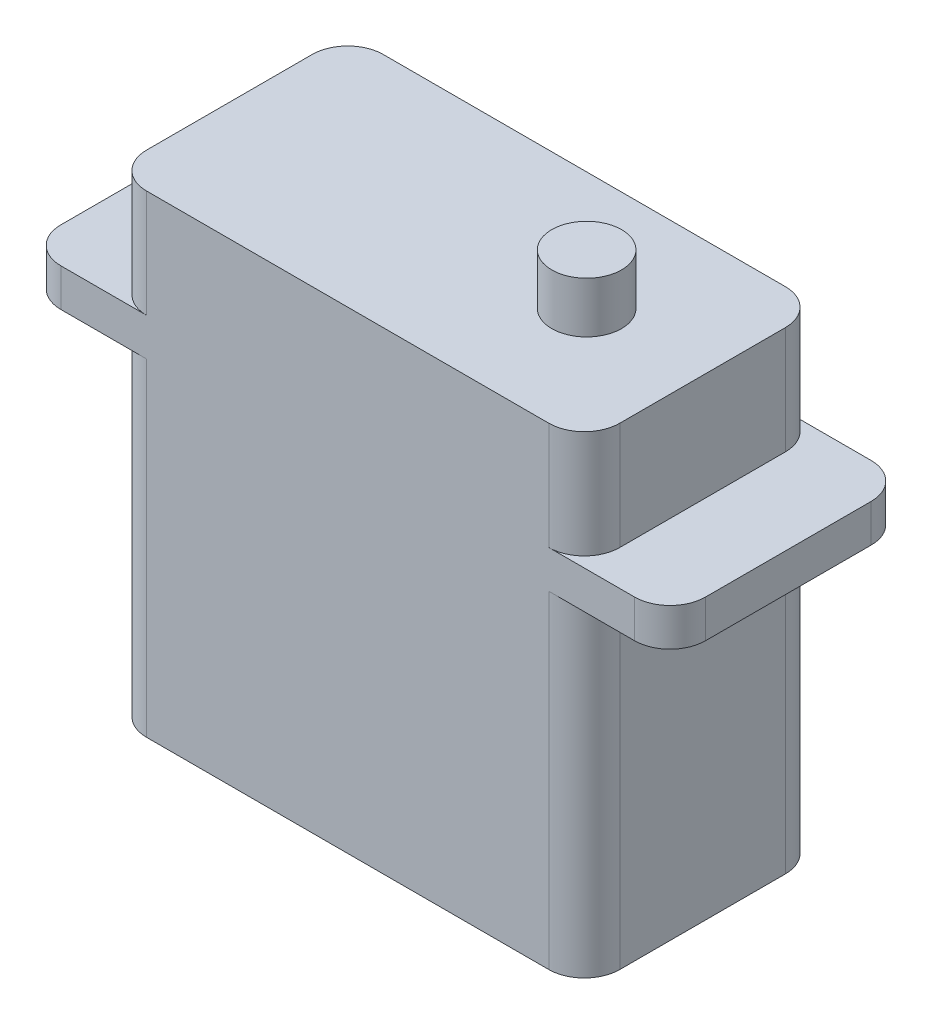
ISO-10303-21;
HEADER;
FILE_DESCRIPTION(('STEP AP214'),'2;1');
FILE_NAME('part.step','',(''),(''),'','','');
FILE_SCHEMA(('AUTOMOTIVE_DESIGN { 1 0 10303 214 1 1 1 1 }'));
ENDSEC;
DATA;
#1=APPLICATION_CONTEXT('core data for automotive mechanical design processes');
#2=APPLICATION_PROTOCOL_DEFINITION('international standard','automotive_design',2000,#1);
#3=PRODUCT_CONTEXT('',#1,'mechanical');
#4=PRODUCT('Part','Part','',(#3));
#5=PRODUCT_RELATED_PRODUCT_CATEGORY('part','',(#4));
#6=PRODUCT_DEFINITION_FORMATION('','',#4);
#7=PRODUCT_DEFINITION_CONTEXT('part definition',#1,'design');
#8=PRODUCT_DEFINITION('design','',#6,#7);
#9=PRODUCT_DEFINITION_SHAPE('','',#8);
#10=(LENGTH_UNIT() NAMED_UNIT(*) SI_UNIT(.MILLI.,.METRE.));
#11=(NAMED_UNIT(*) PLANE_ANGLE_UNIT() SI_UNIT($,.RADIAN.));
#12=(NAMED_UNIT(*) SI_UNIT($,.STERADIAN.) SOLID_ANGLE_UNIT());
#13=UNCERTAINTY_MEASURE_WITH_UNIT(LENGTH_MEASURE(1.E-05),#10,'distance_accuracy_value','');
#14=(GEOMETRIC_REPRESENTATION_CONTEXT(3) GLOBAL_UNCERTAINTY_ASSIGNED_CONTEXT((#13)) GLOBAL_UNIT_ASSIGNED_CONTEXT((#10,
#11,#12)) REPRESENTATION_CONTEXT('',''));
#15=CARTESIAN_POINT('',(0.,0.,0.));
#16=DIRECTION('',(0.,0.,1.));
#17=DIRECTION('',(1.,0.,0.));
#18=AXIS2_PLACEMENT_3D('',#15,#16,#17);
#19=CARTESIAN_POINT('',(20.4990842649381,40.4914206169106,10.25));
#20=DIRECTION('',(-1.,0.,0.));
#21=DIRECTION('',(0.,0.,1.));
#22=AXIS2_PLACEMENT_3D('',#19,#20,#21);
#23=PLANE('',#22);
#24=DIRECTION('',(0.,0.,1.));
#25=VECTOR('',#24,1.);
#26=CARTESIAN_POINT('',(20.4990842649381,31.1639206169106,10.25));
#27=LINE('',#26,#25);
#28=CARTESIAN_POINT('',(20.4990842649381,31.1639206169106,-7.175));
#29=VERTEX_POINT('',#28);
#30=CARTESIAN_POINT('',(20.4990842649381,31.1639206169106,7.175));
#31=VERTEX_POINT('',#30);
#32=EDGE_CURVE('E342',#29,#31,#27,.T.);
#33=ORIENTED_EDGE('',*,*,#32,.F.);
#34=DIRECTION('',(0.,-1.,0.));
#35=VECTOR('',#34,1.);
#36=CARTESIAN_POINT('',(20.4990842649381,40.4914206169106,-7.175));
#37=LINE('',#36,#35);
#38=CARTESIAN_POINT('',(20.4990842649381,40.4914206169106,-7.175));
#39=VERTEX_POINT('',#38);
#40=EDGE_CURVE('E282',#29,#39,#37,.F.);
#41=ORIENTED_EDGE('',*,*,#40,.T.);
#42=DIRECTION('',(0.,0.,-1.));
#43=VECTOR('',#42,1.);
#44=CARTESIAN_POINT('',(20.4990842649381,40.4914206169106,10.25));
#45=LINE('',#44,#43);
#46=CARTESIAN_POINT('',(20.4990842649381,40.4914206169106,7.175));
#47=VERTEX_POINT('',#46);
#48=EDGE_CURVE('E371',#47,#39,#45,.T.);
#49=ORIENTED_EDGE('',*,*,#48,.F.);
#50=DIRECTION('',(0.,-1.,0.));
#51=VECTOR('',#50,1.);
#52=CARTESIAN_POINT('',(20.4990842649381,40.4914206169106,7.175));
#53=LINE('',#52,#51);
#54=EDGE_CURVE('E279',#47,#31,#53,.T.);
#55=ORIENTED_EDGE('',*,*,#54,.T.);
#56=EDGE_LOOP('',(#33,#41,#49,#55));
#57=FACE_BOUND('',#56,.T.);
#58=ADVANCED_FACE('F36',(#57),#23,.F.);
#59=CARTESIAN_POINT('',(-20.5009157350619,40.4914206169106,10.25));
#60=DIRECTION('',(1.,0.,0.));
#61=DIRECTION('',(0.,0.,-1.));
#62=AXIS2_PLACEMENT_3D('',#59,#60,#61);
#63=PLANE('',#62);
#64=DIRECTION('',(0.,0.,1.));
#65=VECTOR('',#64,1.);
#66=CARTESIAN_POINT('',(-20.5009157350619,40.4914206169106,10.25));
#67=LINE('',#66,#65);
#68=CARTESIAN_POINT('',(-20.5009157350619,40.4914206169106,-7.175));
#69=VERTEX_POINT('',#68);
#70=CARTESIAN_POINT('',(-20.5009157350619,40.4914206169106,7.175));
#71=VERTEX_POINT('',#70);
#72=EDGE_CURVE('E353',#69,#71,#67,.T.);
#73=ORIENTED_EDGE('',*,*,#72,.F.);
#74=DIRECTION('',(0.,-1.,0.));
#75=VECTOR('',#74,1.);
#76=CARTESIAN_POINT('',(-20.5009157350619,40.4914206169106,-7.175));
#77=LINE('',#76,#75);
#78=CARTESIAN_POINT('',(-20.5009157350619,31.1639206169106,-7.175));
#79=VERTEX_POINT('',#78);
#80=EDGE_CURVE('E302',#69,#79,#77,.T.);
#81=ORIENTED_EDGE('',*,*,#80,.T.);
#82=DIRECTION('',(0.,0.,-1.));
#83=VECTOR('',#82,1.);
#84=CARTESIAN_POINT('',(-20.5009157350619,31.1639206169106,10.25));
#85=LINE('',#84,#83);
#86=CARTESIAN_POINT('',(-20.5009157350619,31.1639206169106,7.175));
#87=VERTEX_POINT('',#86);
#88=EDGE_CURVE('E331',#87,#79,#85,.T.);
#89=ORIENTED_EDGE('',*,*,#88,.F.);
#90=DIRECTION('',(0.,-1.,0.));
#91=VECTOR('',#90,1.);
#92=CARTESIAN_POINT('',(-20.5009157350619,40.4914206169106,7.175));
#93=LINE('',#92,#91);
#94=EDGE_CURVE('E300',#87,#71,#93,.F.);
#95=ORIENTED_EDGE('',*,*,#94,.T.);
#96=EDGE_LOOP('',(#73,#81,#89,#95));
#97=FACE_BOUND('',#96,.T.);
#98=ADVANCED_FACE('F339',(#97),#63,.F.);
#99=DIRECTION('',(0.,0.,-1.));
#100=VECTOR('',#99,1.);
#101=CARTESIAN_POINT('',(20.4990842649381,-0.508579383089354,10.25));
#102=LINE('',#101,#100);
#103=CARTESIAN_POINT('',(20.4990842649381,-0.508579383089354,7.175));
#104=VERTEX_POINT('',#103);
#105=CARTESIAN_POINT('',(20.4990842649381,-0.508579383089354,-7.175));
#106=VERTEX_POINT('',#105);
#107=EDGE_CURVE('E363',#104,#106,#102,.T.);
#108=ORIENTED_EDGE('',*,*,#107,.T.);
#109=DIRECTION('',(0.,-1.,0.));
#110=VECTOR('',#109,1.);
#111=CARTESIAN_POINT('',(20.4990842649381,40.4914206169106,-7.175));
#112=LINE('',#111,#110);
#113=CARTESIAN_POINT('',(20.4990842649381,27.8839206169106,-7.175));
#114=VERTEX_POINT('',#113);
#115=EDGE_CURVE('E249',#106,#114,#112,.F.);
#116=ORIENTED_EDGE('',*,*,#115,.T.);
#117=DIRECTION('',(0.,0.,1.));
#118=VECTOR('',#117,1.);
#119=CARTESIAN_POINT('',(20.4990842649381,27.8839206169106,10.25));
#120=LINE('',#119,#118);
#121=CARTESIAN_POINT('',(20.4990842649381,27.8839206169106,7.175));
#122=VERTEX_POINT('',#121);
#123=EDGE_CURVE('E343',#114,#122,#120,.T.);
#124=ORIENTED_EDGE('',*,*,#123,.T.);
#125=DIRECTION('',(0.,-1.,0.));
#126=VECTOR('',#125,1.);
#127=CARTESIAN_POINT('',(20.4990842649381,40.4914206169106,7.175));
#128=LINE('',#127,#126);
#129=EDGE_CURVE('E246',#122,#104,#128,.T.);
#130=ORIENTED_EDGE('',*,*,#129,.T.);
#131=EDGE_LOOP('',(#108,#116,#124,#130));
#132=FACE_BOUND('',#131,.T.);
#133=ADVANCED_FACE('F450',(#132),#23,.F.);
#134=CARTESIAN_POINT('',(-20.5009157350619,40.4914206169106,-10.25));
#135=DIRECTION('',(0.,0.,1.));
#136=DIRECTION('',(1.,0.,0.));
#137=AXIS2_PLACEMENT_3D('',#134,#135,#136);
#138=PLANE('',#137);
#139=DIRECTION('',(-1.,0.,0.));
#140=VECTOR('',#139,1.);
#141=CARTESIAN_POINT('',(-27.9321657350619,27.8839206169106,-10.25));
#142=LINE('',#141,#140);
#143=CARTESIAN_POINT('',(24.8553342649381,27.8839206169106,-10.25));
#144=VERTEX_POINT('',#143);
#145=CARTESIAN_POINT('',(17.4240842649381,27.8839206169106,-10.25));
#146=VERTEX_POINT('',#145);
#147=EDGE_CURVE('E218',#144,#146,#142,.T.);
#148=ORIENTED_EDGE('',*,*,#147,.T.);
#149=DIRECTION('',(0.,-1.,0.));
#150=VECTOR('',#149,1.);
#151=CARTESIAN_POINT('',(17.4240842649381,40.4914206169106,-10.25));
#152=LINE('',#151,#150);
#153=CARTESIAN_POINT('',(17.4240842649381,-0.508579383089354,-10.25));
#154=VERTEX_POINT('',#153);
#155=EDGE_CURVE('E235',#146,#154,#152,.T.);
#156=ORIENTED_EDGE('',*,*,#155,.T.);
#157=DIRECTION('',(-1.,0.,0.));
#158=VECTOR('',#157,1.);
#159=CARTESIAN_POINT('',(-20.5009157350619,-0.508579383089354,-10.25));
#160=LINE('',#159,#158);
#161=CARTESIAN_POINT('',(-17.4259157350619,-0.508579383089354,-10.25));
#162=VERTEX_POINT('',#161);
#163=EDGE_CURVE('E366',#154,#162,#160,.T.);
#164=ORIENTED_EDGE('',*,*,#163,.T.);
#165=DIRECTION('',(0.,-1.,0.));
#166=VECTOR('',#165,1.);
#167=CARTESIAN_POINT('',(-17.4259157350619,40.4914206169106,-10.25));
#168=LINE('',#167,#166);
#169=CARTESIAN_POINT('',(-17.4259157350619,27.8839206169106,-10.25));
#170=VERTEX_POINT('',#169);
#171=EDGE_CURVE('E217',#162,#170,#168,.F.);
#172=ORIENTED_EDGE('',*,*,#171,.T.);
#173=CARTESIAN_POINT('',(-24.8571657350619,27.8839206169106,-10.25));
#174=VERTEX_POINT('',#173);
#175=EDGE_CURVE('E200',#170,#174,#142,.T.);
#176=ORIENTED_EDGE('',*,*,#175,.T.);
#177=DIRECTION('',(0.,-1.,0.));
#178=VECTOR('',#177,1.);
#179=CARTESIAN_POINT('',(-24.8571657350619,40.4914206169106,-10.25));
#180=LINE('',#179,#178);
#181=CARTESIAN_POINT('',(-24.8571657350619,31.1639206169106,-10.25));
#182=VERTEX_POINT('',#181);
#183=EDGE_CURVE('E213',#174,#182,#180,.F.);
#184=ORIENTED_EDGE('',*,*,#183,.T.);
#185=DIRECTION('',(-1.,0.,0.));
#186=VECTOR('',#185,1.);
#187=CARTESIAN_POINT('',(-27.9321657350619,31.1639206169106,-10.25));
#188=LINE('',#187,#186);
#189=CARTESIAN_POINT('',(-17.4259157350619,31.1639206169106,-10.25));
#190=VERTEX_POINT('',#189);
#191=EDGE_CURVE('E387',#190,#182,#188,.T.);
#192=ORIENTED_EDGE('',*,*,#191,.F.);
#193=DIRECTION('',(0.,-1.,0.));
#194=VECTOR('',#193,1.);
#195=CARTESIAN_POINT('',(-17.4259157350619,40.4914206169106,-10.25));
#196=LINE('',#195,#194);
#197=CARTESIAN_POINT('',(-17.4259157350619,40.4914206169106,-10.25));
#198=VERTEX_POINT('',#197);
#199=EDGE_CURVE('E225',#190,#198,#196,.F.);
#200=ORIENTED_EDGE('',*,*,#199,.T.);
#201=DIRECTION('',(-1.,0.,0.));
#202=VECTOR('',#201,1.);
#203=CARTESIAN_POINT('',(-20.5009157350619,40.4914206169106,-10.25));
#204=LINE('',#203,#202);
#205=CARTESIAN_POINT('',(17.4240842649381,40.4914206169106,-10.25));
#206=VERTEX_POINT('',#205);
#207=EDGE_CURVE('E359',#206,#198,#204,.T.);
#208=ORIENTED_EDGE('',*,*,#207,.F.);
#209=DIRECTION('',(0.,-1.,0.));
#210=VECTOR('',#209,1.);
#211=CARTESIAN_POINT('',(17.4240842649381,40.4914206169106,-10.25));
#212=LINE('',#211,#210);
#213=CARTESIAN_POINT('',(17.4240842649381,31.1639206169106,-10.25));
#214=VERTEX_POINT('',#213);
#215=EDGE_CURVE('E224',#206,#214,#212,.T.);
#216=ORIENTED_EDGE('',*,*,#215,.T.);
#217=CARTESIAN_POINT('',(24.8553342649381,31.1639206169106,-10.25));
#218=VERTEX_POINT('',#217);
#219=EDGE_CURVE('E219',#218,#214,#188,.T.);
#220=ORIENTED_EDGE('',*,*,#219,.F.);
#221=DIRECTION('',(0.,-1.,0.));
#222=VECTOR('',#221,1.);
#223=CARTESIAN_POINT('',(24.8553342649381,27.8839206169106,-10.25));
#224=LINE('',#223,#222);
#225=EDGE_CURVE('E228',#218,#144,#224,.T.);
#226=ORIENTED_EDGE('',*,*,#225,.T.);
#227=EDGE_LOOP('',(#148,#156,#164,#172,#176,#184,#192,#200,#208,#216,#220,#226));
#228=FACE_BOUND('',#227,.T.);
#229=ADVANCED_FACE('F212',(#228),#138,.F.);
#230=DIRECTION('',(0.,0.,-1.));
#231=VECTOR('',#230,1.);
#232=CARTESIAN_POINT('',(-20.5009157350619,27.8839206169106,10.25));
#233=LINE('',#232,#231);
#234=CARTESIAN_POINT('',(-20.5009157350619,27.8839206169106,7.175));
#235=VERTEX_POINT('',#234);
#236=CARTESIAN_POINT('',(-20.5009157350619,27.8839206169106,-7.175));
#237=VERTEX_POINT('',#236);
#238=EDGE_CURVE('E383',#235,#237,#233,.T.);
#239=ORIENTED_EDGE('',*,*,#238,.T.);
#240=DIRECTION('',(0.,-1.,0.));
#241=VECTOR('',#240,1.);
#242=CARTESIAN_POINT('',(-20.5009157350619,40.4914206169106,-7.175));
#243=LINE('',#242,#241);
#244=CARTESIAN_POINT('',(-20.5009157350619,-0.508579383089354,-7.175));
#245=VERTEX_POINT('',#244);
#246=EDGE_CURVE('E306',#237,#245,#243,.T.);
#247=ORIENTED_EDGE('',*,*,#246,.T.);
#248=DIRECTION('',(0.,0.,1.));
#249=VECTOR('',#248,1.);
#250=CARTESIAN_POINT('',(-20.5009157350619,-0.508579383089354,10.25));
#251=LINE('',#250,#249);
#252=CARTESIAN_POINT('',(-20.5009157350619,-0.508579383089354,7.175));
#253=VERTEX_POINT('',#252);
#254=EDGE_CURVE('E368',#245,#253,#251,.T.);
#255=ORIENTED_EDGE('',*,*,#254,.T.);
#256=DIRECTION('',(0.,-1.,0.));
#257=VECTOR('',#256,1.);
#258=CARTESIAN_POINT('',(-20.5009157350619,40.4914206169106,7.175));
#259=LINE('',#258,#257);
#260=EDGE_CURVE('E58',#253,#235,#259,.F.);
#261=ORIENTED_EDGE('',*,*,#260,.T.);
#262=EDGE_LOOP('',(#239,#247,#255,#261));
#263=FACE_BOUND('',#262,.T.);
#264=ADVANCED_FACE('F455',(#263),#63,.F.);
#265=CARTESIAN_POINT('',(-20.5009157350619,40.4914206169106,10.25));
#266=DIRECTION('',(0.,0.,-1.));
#267=DIRECTION('',(-1.,0.,0.));
#268=AXIS2_PLACEMENT_3D('',#265,#266,#267);
#269=PLANE('',#268);
#270=DIRECTION('',(1.,0.,0.));
#271=VECTOR('',#270,1.);
#272=CARTESIAN_POINT('',(-20.5009157350619,-0.508579383089354,10.25));
#273=LINE('',#272,#271);
#274=CARTESIAN_POINT('',(-17.4259157350619,-0.508579383089354,10.25));
#275=VERTEX_POINT('',#274);
#276=CARTESIAN_POINT('',(17.4240842649381,-0.508579383089354,10.25));
#277=VERTEX_POINT('',#276);
#278=EDGE_CURVE('E370',#275,#277,#273,.T.);
#279=ORIENTED_EDGE('',*,*,#278,.T.);
#280=DIRECTION('',(0.,-1.,0.));
#281=VECTOR('',#280,1.);
#282=CARTESIAN_POINT('',(17.4240842649381,40.4914206169106,10.25));
#283=LINE('',#282,#281);
#284=CARTESIAN_POINT('',(17.424084264938,27.8839206169106,10.25));
#285=VERTEX_POINT('',#284);
#286=EDGE_CURVE('E264',#277,#285,#283,.F.);
#287=ORIENTED_EDGE('',*,*,#286,.T.);
#288=DIRECTION('',(1.,0.,0.));
#289=VECTOR('',#288,1.);
#290=CARTESIAN_POINT('',(-27.9321657350619,27.8839206169106,10.25));
#291=LINE('',#290,#289);
#292=CARTESIAN_POINT('',(24.8553342649381,27.8839206169106,10.25));
#293=VERTEX_POINT('',#292);
#294=EDGE_CURVE('E397',#285,#293,#291,.T.);
#295=ORIENTED_EDGE('',*,*,#294,.T.);
#296=DIRECTION('',(0.,1.,0.));
#297=VECTOR('',#296,1.);
#298=CARTESIAN_POINT('',(24.8553342649381,31.1639206169106,10.25));
#299=LINE('',#298,#297);
#300=CARTESIAN_POINT('',(24.8553342649381,31.1639206169106,10.25));
#301=VERTEX_POINT('',#300);
#302=EDGE_CURVE('E261',#293,#301,#299,.T.);
#303=ORIENTED_EDGE('',*,*,#302,.T.);
#304=DIRECTION('',(1.,0.,0.));
#305=VECTOR('',#304,1.);
#306=CARTESIAN_POINT('',(-27.9321657350619,31.1639206169106,10.25));
#307=LINE('',#306,#305);
#308=CARTESIAN_POINT('',(17.4240842649381,31.1639206169106,10.25));
#309=VERTEX_POINT('',#308);
#310=EDGE_CURVE('E399',#309,#301,#307,.T.);
#311=ORIENTED_EDGE('',*,*,#310,.F.);
#312=DIRECTION('',(0.,-1.,0.));
#313=VECTOR('',#312,1.);
#314=CARTESIAN_POINT('',(17.4240842649381,40.4914206169106,10.25));
#315=LINE('',#314,#313);
#316=CARTESIAN_POINT('',(17.4240842649381,40.4914206169106,10.25));
#317=VERTEX_POINT('',#316);
#318=EDGE_CURVE('E259',#309,#317,#315,.F.);
#319=ORIENTED_EDGE('',*,*,#318,.T.);
#320=DIRECTION('',(1.,0.,0.));
#321=VECTOR('',#320,1.);
#322=CARTESIAN_POINT('',(-20.5009157350619,40.4914206169106,10.25));
#323=LINE('',#322,#321);
#324=CARTESIAN_POINT('',(-17.4259157350619,40.4914206169106,10.25));
#325=VERTEX_POINT('',#324);
#326=EDGE_CURVE('E351',#325,#317,#323,.T.);
#327=ORIENTED_EDGE('',*,*,#326,.F.);
#328=DIRECTION('',(0.,-1.,0.));
#329=VECTOR('',#328,1.);
#330=CARTESIAN_POINT('',(-17.4259157350619,40.4914206169106,10.25));
#331=LINE('',#330,#329);
#332=CARTESIAN_POINT('',(-17.4259157350619,31.1639206169106,10.25));
#333=VERTEX_POINT('',#332);
#334=EDGE_CURVE('E251',#325,#333,#331,.T.);
#335=ORIENTED_EDGE('',*,*,#334,.T.);
#336=CARTESIAN_POINT('',(-24.8571657350619,31.1639206169106,10.25));
#337=VERTEX_POINT('',#336);
#338=EDGE_CURVE('E333',#337,#333,#307,.T.);
#339=ORIENTED_EDGE('',*,*,#338,.F.);
#340=DIRECTION('',(0.,1.,0.));
#341=VECTOR('',#340,1.);
#342=CARTESIAN_POINT('',(-24.8571657350619,40.4914206169106,10.25));
#343=LINE('',#342,#341);
#344=CARTESIAN_POINT('',(-24.8571657350619,27.8839206169106,10.25));
#345=VERTEX_POINT('',#344);
#346=EDGE_CURVE('E257',#337,#345,#343,.F.);
#347=ORIENTED_EDGE('',*,*,#346,.T.);
#348=CARTESIAN_POINT('',(-17.4259157350619,27.8839206169106,10.25));
#349=VERTEX_POINT('',#348);
#350=EDGE_CURVE('E395',#345,#349,#291,.T.);
#351=ORIENTED_EDGE('',*,*,#350,.T.);
#352=DIRECTION('',(0.,-1.,0.));
#353=VECTOR('',#352,1.);
#354=CARTESIAN_POINT('',(-17.4259157350619,40.4914206169106,10.25));
#355=LINE('',#354,#353);
#356=EDGE_CURVE('E254',#349,#275,#355,.T.);
#357=ORIENTED_EDGE('',*,*,#356,.T.);
#358=EDGE_LOOP('',(#279,#287,#295,#303,#311,#319,#327,#335,#339,#347,#351,#357));
#359=FACE_BOUND('',#358,.T.);
#360=ADVANCED_FACE('F356',(#359),#269,.F.);
#361=CARTESIAN_POINT('',(-0.000915735061933409,40.4914206169106,0.));
#362=DIRECTION('',(0.,-1.,0.));
#363=DIRECTION('',(0.,0.,-1.));
#364=AXIS2_PLACEMENT_3D('',#361,#362,#363);
#365=PLANE('',#364);
#366=CARTESIAN_POINT('',(10.4540842649381,40.4914206169106,0.));
#367=DIRECTION('',(0.,-1.,0.));
#368=DIRECTION('',(0.,0.,-1.));
#369=AXIS2_PLACEMENT_3D('',#366,#367,#368);
#370=CIRCLE('',#369,3.02375);
#371=CARTESIAN_POINT('',(10.4540842649381,40.4914206169106,-3.02375));
#372=VERTEX_POINT('',#371);
#373=EDGE_CURVE('E11',#372,#372,#370,.F.);
#374=ORIENTED_EDGE('',*,*,#373,.F.);
#375=EDGE_LOOP('',(#374));
#376=FACE_BOUND('',#375,.T.);
#377=ORIENTED_EDGE('',*,*,#48,.T.);
#378=CARTESIAN_POINT('',(17.4240842649381,40.4914206169106,-7.175));
#379=DIRECTION('',(0.,-1.,0.));
#380=DIRECTION('',(0.,0.,-1.));
#381=AXIS2_PLACEMENT_3D('',#378,#379,#380);
#382=CIRCLE('',#381,3.075);
#383=EDGE_CURVE('E290',#39,#206,#382,.F.);
#384=ORIENTED_EDGE('',*,*,#383,.T.);
#385=ORIENTED_EDGE('',*,*,#207,.T.);
#386=CARTESIAN_POINT('',(-17.4259157350619,40.4914206169106,-7.175));
#387=DIRECTION('',(0.,-1.,0.));
#388=DIRECTION('',(0.,0.,-1.));
#389=AXIS2_PLACEMENT_3D('',#386,#387,#388);
#390=CIRCLE('',#389,3.075);
#391=EDGE_CURVE('E286',#198,#69,#390,.F.);
#392=ORIENTED_EDGE('',*,*,#391,.T.);
#393=ORIENTED_EDGE('',*,*,#72,.T.);
#394=CARTESIAN_POINT('',(-17.4259157350619,40.4914206169106,7.175));
#395=DIRECTION('',(0.,-1.,0.));
#396=DIRECTION('',(0.,0.,-1.));
#397=AXIS2_PLACEMENT_3D('',#394,#395,#396);
#398=CIRCLE('',#397,3.075);
#399=EDGE_CURVE('E284',#71,#325,#398,.F.);
#400=ORIENTED_EDGE('',*,*,#399,.T.);
#401=ORIENTED_EDGE('',*,*,#326,.T.);
#402=CARTESIAN_POINT('',(17.4240842649381,40.4914206169106,7.175));
#403=DIRECTION('',(0.,-1.,0.));
#404=DIRECTION('',(0.,0.,-1.));
#405=AXIS2_PLACEMENT_3D('',#402,#403,#404);
#406=CIRCLE('',#405,3.075);
#407=EDGE_CURVE('E288',#317,#47,#406,.F.);
#408=ORIENTED_EDGE('',*,*,#407,.T.);
#409=EDGE_LOOP('',(#377,#384,#385,#392,#393,#400,#401,#408));
#410=FACE_BOUND('',#409,.T.);
#411=ADVANCED_FACE('F350',(#376,#410),#365,.F.);
#412=CARTESIAN_POINT('',(-0.000915735061933409,-0.508579383089354,0.));
#413=DIRECTION('',(0.,-1.,0.));
#414=DIRECTION('',(0.,0.,-1.));
#415=AXIS2_PLACEMENT_3D('',#412,#413,#414);
#416=PLANE('',#415);
#417=ORIENTED_EDGE('',*,*,#163,.F.);
#418=CARTESIAN_POINT('',(17.4240842649381,-0.508579383089354,-7.175));
#419=DIRECTION('',(0.,-1.,0.));
#420=DIRECTION('',(0.,0.,-1.));
#421=AXIS2_PLACEMENT_3D('',#418,#419,#420);
#422=CIRCLE('',#421,3.075);
#423=EDGE_CURVE('E244',#154,#106,#422,.T.);
#424=ORIENTED_EDGE('',*,*,#423,.T.);
#425=ORIENTED_EDGE('',*,*,#107,.F.);
#426=CARTESIAN_POINT('',(17.4240842649381,-0.508579383089354,7.175));
#427=DIRECTION('',(0.,-1.,0.));
#428=DIRECTION('',(0.,0.,-1.));
#429=AXIS2_PLACEMENT_3D('',#426,#427,#428);
#430=CIRCLE('',#429,3.075);
#431=EDGE_CURVE('E242',#104,#277,#430,.T.);
#432=ORIENTED_EDGE('',*,*,#431,.T.);
#433=ORIENTED_EDGE('',*,*,#278,.F.);
#434=CARTESIAN_POINT('',(-17.4259157350619,-0.508579383089354,7.175));
#435=DIRECTION('',(0.,-1.,0.));
#436=DIRECTION('',(0.,0.,-1.));
#437=AXIS2_PLACEMENT_3D('',#434,#435,#436);
#438=CIRCLE('',#437,3.075);
#439=EDGE_CURVE('E238',#275,#253,#438,.T.);
#440=ORIENTED_EDGE('',*,*,#439,.T.);
#441=ORIENTED_EDGE('',*,*,#254,.F.);
#442=CARTESIAN_POINT('',(-17.4259157350619,-0.508579383089354,-7.175));
#443=DIRECTION('',(0.,-1.,0.));
#444=DIRECTION('',(0.,0.,-1.));
#445=AXIS2_PLACEMENT_3D('',#442,#443,#444);
#446=CIRCLE('',#445,3.075);
#447=EDGE_CURVE('E240',#245,#162,#446,.T.);
#448=ORIENTED_EDGE('',*,*,#447,.T.);
#449=EDGE_LOOP('',(#417,#424,#425,#432,#433,#440,#441,#448));
#450=FACE_BOUND('',#449,.T.);
#451=ADVANCED_FACE('F476',(#450),#416,.T.);
#452=CARTESIAN_POINT('',(-27.9321657350619,27.8839206169106,-66.208710727196));
#453=DIRECTION('',(1.,0.,0.));
#454=DIRECTION('',(0.,0.,-1.));
#455=AXIS2_PLACEMENT_3D('',#452,#453,#454);
#456=PLANE('',#455);
#457=DIRECTION('',(0.,0.,1.));
#458=VECTOR('',#457,1.);
#459=CARTESIAN_POINT('',(-27.9321657350619,27.8839206169106,-66.208710727196));
#460=LINE('',#459,#458);
#461=CARTESIAN_POINT('',(-27.9321657350619,27.8839206169106,-7.175));
#462=VERTEX_POINT('',#461);
#463=CARTESIAN_POINT('',(-27.9321657350619,27.8839206169106,7.17500000000001));
#464=VERTEX_POINT('',#463);
#465=EDGE_CURVE('E203',#462,#464,#460,.T.);
#466=ORIENTED_EDGE('',*,*,#465,.T.);
#467=DIRECTION('',(0.,1.,0.));
#468=VECTOR('',#467,1.);
#469=CARTESIAN_POINT('',(-27.9321657350619,27.8839206169106,7.17500000000001));
#470=LINE('',#469,#468);
#471=CARTESIAN_POINT('',(-27.9321657350619,31.1639206169106,7.17500000000001));
#472=VERTEX_POINT('',#471);
#473=EDGE_CURVE('E294',#464,#472,#470,.T.);
#474=ORIENTED_EDGE('',*,*,#473,.T.);
#475=DIRECTION('',(0.,0.,1.));
#476=VECTOR('',#475,1.);
#477=CARTESIAN_POINT('',(-27.9321657350619,31.1639206169106,-66.208710727196));
#478=LINE('',#477,#476);
#479=CARTESIAN_POINT('',(-27.9321657350619,31.1639206169106,-7.175));
#480=VERTEX_POINT('',#479);
#481=EDGE_CURVE('E385',#480,#472,#478,.T.);
#482=ORIENTED_EDGE('',*,*,#481,.F.);
#483=DIRECTION('',(0.,-1.,0.));
#484=VECTOR('',#483,1.);
#485=CARTESIAN_POINT('',(-27.9321657350619,27.8839206169106,-7.175));
#486=LINE('',#485,#484);
#487=EDGE_CURVE('E292',#480,#462,#486,.T.);
#488=ORIENTED_EDGE('',*,*,#487,.T.);
#489=EDGE_LOOP('',(#466,#474,#482,#488));
#490=FACE_BOUND('',#489,.T.);
#491=ADVANCED_FACE('F558',(#490),#456,.F.);
#492=CARTESIAN_POINT('',(-27.9321657350619,27.8839206169106,-66.208710727196));
#493=DIRECTION('',(0.,-1.,0.));
#494=DIRECTION('',(0.,0.,-1.));
#495=AXIS2_PLACEMENT_3D('',#492,#493,#494);
#496=PLANE('',#495);
#497=ORIENTED_EDGE('',*,*,#350,.F.);
#498=CARTESIAN_POINT('',(-24.8571657350619,27.8839206169106,7.17500000000001));
#499=DIRECTION('',(0.,-1.,0.));
#500=DIRECTION('',(0.,0.,-1.));
#501=AXIS2_PLACEMENT_3D('',#498,#499,#500);
#502=CIRCLE('',#501,3.075);
#503=EDGE_CURVE('E208',#345,#464,#502,.T.);
#504=ORIENTED_EDGE('',*,*,#503,.T.);
#505=ORIENTED_EDGE('',*,*,#465,.F.);
#506=CARTESIAN_POINT('',(-24.8571657350619,27.8839206169106,-7.175));
#507=DIRECTION('',(0.,-1.,0.));
#508=DIRECTION('',(0.,0.,-1.));
#509=AXIS2_PLACEMENT_3D('',#506,#507,#508);
#510=CIRCLE('',#509,3.075);
#511=EDGE_CURVE('E196',#462,#174,#510,.T.);
#512=ORIENTED_EDGE('',*,*,#511,.T.);
#513=ORIENTED_EDGE('',*,*,#175,.F.);
#514=CARTESIAN_POINT('',(-17.4259157350619,27.8839206169106,-7.175));
#515=DIRECTION('',(0.,-1.,0.));
#516=DIRECTION('',(0.,0.,-1.));
#517=AXIS2_PLACEMENT_3D('',#514,#515,#516);
#518=CIRCLE('',#517,3.075);
#519=EDGE_CURVE('E51',#170,#237,#518,.F.);
#520=ORIENTED_EDGE('',*,*,#519,.T.);
#521=ORIENTED_EDGE('',*,*,#238,.F.);
#522=CARTESIAN_POINT('',(-17.4259157350619,27.8839206169106,7.175));
#523=DIRECTION('',(0.,-1.,0.));
#524=DIRECTION('',(0.,0.,-1.));
#525=AXIS2_PLACEMENT_3D('',#522,#523,#524);
#526=CIRCLE('',#525,3.075);
#527=EDGE_CURVE('E323',#235,#349,#526,.F.);
#528=ORIENTED_EDGE('',*,*,#527,.T.);
#529=EDGE_LOOP('',(#497,#504,#505,#512,#513,#520,#521,#528));
#530=FACE_BOUND('',#529,.T.);
#531=ADVANCED_FACE('F199',(#530),#496,.T.);
#532=CARTESIAN_POINT('',(-27.9321657350619,31.1639206169106,-66.208710727196));
#533=DIRECTION('',(0.,-1.,0.));
#534=DIRECTION('',(0.,0.,-1.));
#535=AXIS2_PLACEMENT_3D('',#532,#533,#534);
#536=PLANE('',#535);
#537=ORIENTED_EDGE('',*,*,#481,.T.);
#538=CARTESIAN_POINT('',(-24.8571657350619,31.1639206169106,7.17500000000001));
#539=DIRECTION('',(0.,-1.,0.));
#540=DIRECTION('',(0.,0.,-1.));
#541=AXIS2_PLACEMENT_3D('',#538,#539,#540);
#542=CIRCLE('',#541,3.075);
#543=EDGE_CURVE('E209',#472,#337,#542,.F.);
#544=ORIENTED_EDGE('',*,*,#543,.T.);
#545=ORIENTED_EDGE('',*,*,#338,.T.);
#546=CARTESIAN_POINT('',(-17.4259157350619,31.1639206169106,7.175));
#547=DIRECTION('',(0.,-1.,0.));
#548=DIRECTION('',(0.,0.,-1.));
#549=AXIS2_PLACEMENT_3D('',#546,#547,#548);
#550=CIRCLE('',#549,3.075);
#551=EDGE_CURVE('E44',#333,#87,#550,.T.);
#552=ORIENTED_EDGE('',*,*,#551,.T.);
#553=ORIENTED_EDGE('',*,*,#88,.T.);
#554=CARTESIAN_POINT('',(-17.4259157350619,31.1639206169106,-7.175));
#555=DIRECTION('',(0.,-1.,0.));
#556=DIRECTION('',(0.,0.,-1.));
#557=AXIS2_PLACEMENT_3D('',#554,#555,#556);
#558=CIRCLE('',#557,3.075);
#559=EDGE_CURVE('E319',#79,#190,#558,.T.);
#560=ORIENTED_EDGE('',*,*,#559,.T.);
#561=ORIENTED_EDGE('',*,*,#191,.T.);
#562=CARTESIAN_POINT('',(-24.8571657350619,31.1639206169106,-7.175));
#563=DIRECTION('',(0.,-1.,0.));
#564=DIRECTION('',(0.,0.,-1.));
#565=AXIS2_PLACEMENT_3D('',#562,#563,#564);
#566=CIRCLE('',#565,3.075);
#567=EDGE_CURVE('E223',#182,#480,#566,.F.);
#568=ORIENTED_EDGE('',*,*,#567,.T.);
#569=EDGE_LOOP('',(#537,#544,#545,#552,#553,#560,#561,#568));
#570=FACE_BOUND('',#569,.T.);
#571=ADVANCED_FACE('F330',(#570),#536,.F.);
#572=ORIENTED_EDGE('',*,*,#310,.T.);
#573=CARTESIAN_POINT('',(24.8553342649381,31.1639206169106,7.175));
#574=DIRECTION('',(0.,-1.,0.));
#575=DIRECTION('',(0.,0.,-1.));
#576=AXIS2_PLACEMENT_3D('',#573,#574,#575);
#577=CIRCLE('',#576,3.075);
#578=CARTESIAN_POINT('',(27.9303342649381,31.1639206169106,7.17500000000001));
#579=VERTEX_POINT('',#578);
#580=EDGE_CURVE('E269',#301,#579,#577,.F.);
#581=ORIENTED_EDGE('',*,*,#580,.T.);
#582=DIRECTION('',(0.,0.,1.));
#583=VECTOR('',#582,1.);
#584=CARTESIAN_POINT('',(27.9303342649381,31.1639206169106,-66.208710727196));
#585=LINE('',#584,#583);
#586=CARTESIAN_POINT('',(27.9303342649381,31.1639206169106,-7.175));
#587=VERTEX_POINT('',#586);
#588=EDGE_CURVE('E388',#587,#579,#585,.T.);
#589=ORIENTED_EDGE('',*,*,#588,.F.);
#590=CARTESIAN_POINT('',(24.8553342649381,31.1639206169106,-7.175));
#591=DIRECTION('',(0.,-1.,0.));
#592=DIRECTION('',(0.,0.,-1.));
#593=AXIS2_PLACEMENT_3D('',#590,#591,#592);
#594=CIRCLE('',#593,3.075);
#595=EDGE_CURVE('E267',#587,#218,#594,.F.);
#596=ORIENTED_EDGE('',*,*,#595,.T.);
#597=ORIENTED_EDGE('',*,*,#219,.T.);
#598=CARTESIAN_POINT('',(17.4240842649381,31.1639206169106,-7.175));
#599=DIRECTION('',(0.,-1.,0.));
#600=DIRECTION('',(0.,0.,-1.));
#601=AXIS2_PLACEMENT_3D('',#598,#599,#600);
#602=CIRCLE('',#601,3.075);
#603=EDGE_CURVE('E314',#214,#29,#602,.T.);
#604=ORIENTED_EDGE('',*,*,#603,.T.);
#605=ORIENTED_EDGE('',*,*,#32,.T.);
#606=CARTESIAN_POINT('',(17.4240842649381,31.1639206169106,7.175));
#607=DIRECTION('',(0.,-1.,0.));
#608=DIRECTION('',(0.,0.,-1.));
#609=AXIS2_PLACEMENT_3D('',#606,#607,#608);
#610=CIRCLE('',#609,3.075);
#611=EDGE_CURVE('E316',#31,#309,#610,.T.);
#612=ORIENTED_EDGE('',*,*,#611,.T.);
#613=EDGE_LOOP('',(#572,#581,#589,#596,#597,#604,#605,#612));
#614=FACE_BOUND('',#613,.T.);
#615=ADVANCED_FACE('F407',(#614),#536,.F.);
#616=DIRECTION('',(0.,0.,1.));
#617=VECTOR('',#616,1.);
#618=CARTESIAN_POINT('',(27.9303342649381,27.8839206169106,-66.208710727196));
#619=LINE('',#618,#617);
#620=CARTESIAN_POINT('',(27.9303342649381,27.8839206169106,-7.175));
#621=VERTEX_POINT('',#620);
#622=CARTESIAN_POINT('',(27.9303342649381,27.8839206169106,7.17500000000001));
#623=VERTEX_POINT('',#622);
#624=EDGE_CURVE('E391',#621,#623,#619,.T.);
#625=ORIENTED_EDGE('',*,*,#624,.T.);
#626=CARTESIAN_POINT('',(24.8553342649381,27.8839206169106,7.175));
#627=DIRECTION('',(0.,-1.,0.));
#628=DIRECTION('',(0.,0.,-1.));
#629=AXIS2_PLACEMENT_3D('',#626,#627,#628);
#630=CIRCLE('',#629,3.075);
#631=EDGE_CURVE('E277',#623,#293,#630,.T.);
#632=ORIENTED_EDGE('',*,*,#631,.T.);
#633=ORIENTED_EDGE('',*,*,#294,.F.);
#634=CARTESIAN_POINT('',(17.4240842649381,27.8839206169106,7.175));
#635=DIRECTION('',(0.,-1.,0.));
#636=DIRECTION('',(0.,0.,-1.));
#637=AXIS2_PLACEMENT_3D('',#634,#635,#636);
#638=CIRCLE('',#637,3.075);
#639=EDGE_CURVE('E312',#285,#122,#638,.F.);
#640=ORIENTED_EDGE('',*,*,#639,.T.);
#641=ORIENTED_EDGE('',*,*,#123,.F.);
#642=CARTESIAN_POINT('',(17.4240842649381,27.8839206169106,-7.175));
#643=DIRECTION('',(0.,-1.,0.));
#644=DIRECTION('',(0.,0.,-1.));
#645=AXIS2_PLACEMENT_3D('',#642,#643,#644);
#646=CIRCLE('',#645,3.075);
#647=EDGE_CURVE('E309',#114,#146,#646,.F.);
#648=ORIENTED_EDGE('',*,*,#647,.T.);
#649=ORIENTED_EDGE('',*,*,#147,.F.);
#650=CARTESIAN_POINT('',(24.8553342649381,27.8839206169106,-7.175));
#651=DIRECTION('',(0.,-1.,0.));
#652=DIRECTION('',(0.,0.,-1.));
#653=AXIS2_PLACEMENT_3D('',#650,#651,#652);
#654=CIRCLE('',#653,3.075);
#655=EDGE_CURVE('E275',#144,#621,#654,.T.);
#656=ORIENTED_EDGE('',*,*,#655,.T.);
#657=EDGE_LOOP('',(#625,#632,#633,#640,#641,#648,#649,#656));
#658=FACE_BOUND('',#657,.T.);
#659=ADVANCED_FACE('F420',(#658),#496,.T.);
#660=CARTESIAN_POINT('',(27.9303342649381,27.8839206169106,-66.208710727196));
#661=DIRECTION('',(1.,0.,0.));
#662=DIRECTION('',(0.,1.,0.));
#663=AXIS2_PLACEMENT_3D('',#660,#661,#662);
#664=PLANE('',#663);
#665=ORIENTED_EDGE('',*,*,#588,.T.);
#666=DIRECTION('',(0.,1.,0.));
#667=VECTOR('',#666,1.);
#668=CARTESIAN_POINT('',(27.9303342649381,27.8839206169106,7.175));
#669=LINE('',#668,#667);
#670=EDGE_CURVE('E273',#579,#623,#669,.F.);
#671=ORIENTED_EDGE('',*,*,#670,.T.);
#672=ORIENTED_EDGE('',*,*,#624,.F.);
#673=DIRECTION('',(0.,-1.,0.));
#674=VECTOR('',#673,1.);
#675=CARTESIAN_POINT('',(27.9303342649381,31.1639206169106,-7.175));
#676=LINE('',#675,#674);
#677=EDGE_CURVE('E271',#621,#587,#676,.F.);
#678=ORIENTED_EDGE('',*,*,#677,.T.);
#679=EDGE_LOOP('',(#665,#671,#672,#678));
#680=FACE_BOUND('',#679,.T.);
#681=ADVANCED_FACE('F417',(#680),#664,.T.);
#682=CARTESIAN_POINT('',(17.4240842649381,40.4914206169106,-7.175));
#683=DIRECTION('',(0.,-1.,0.));
#684=DIRECTION('',(0.,0.,-1.));
#685=AXIS2_PLACEMENT_3D('',#682,#683,#684);
#686=CYLINDRICAL_SURFACE('',#685,3.075);
#687=ORIENTED_EDGE('',*,*,#647,.F.);
#688=ORIENTED_EDGE('',*,*,#115,.F.);
#689=ORIENTED_EDGE('',*,*,#423,.F.);
#690=ORIENTED_EDGE('',*,*,#155,.F.);
#691=EDGE_LOOP('',(#687,#688,#689,#690));
#692=FACE_BOUND('',#691,.T.);
#693=ADVANCED_FACE('F470',(#692),#686,.T.);
#694=CARTESIAN_POINT('',(17.4240842649381,40.4914206169106,7.175));
#695=DIRECTION('',(0.,-1.,0.));
#696=DIRECTION('',(0.,0.,-1.));
#697=AXIS2_PLACEMENT_3D('',#694,#695,#696);
#698=CYLINDRICAL_SURFACE('',#697,3.075);
#699=ORIENTED_EDGE('',*,*,#639,.F.);
#700=ORIENTED_EDGE('',*,*,#286,.F.);
#701=ORIENTED_EDGE('',*,*,#431,.F.);
#702=ORIENTED_EDGE('',*,*,#129,.F.);
#703=EDGE_LOOP('',(#699,#700,#701,#702));
#704=FACE_BOUND('',#703,.T.);
#705=ADVANCED_FACE('F474',(#704),#698,.T.);
#706=CARTESIAN_POINT('',(24.855334264938,40.4914206169107,7.175));
#707=DIRECTION('',(0.,-1.,0.));
#708=DIRECTION('',(1.,0.,0.));
#709=AXIS2_PLACEMENT_3D('',#706,#707,#708);
#710=CYLINDRICAL_SURFACE('',#709,3.075);
#711=ORIENTED_EDGE('',*,*,#631,.F.);
#712=ORIENTED_EDGE('',*,*,#670,.F.);
#713=ORIENTED_EDGE('',*,*,#580,.F.);
#714=ORIENTED_EDGE('',*,*,#302,.F.);
#715=EDGE_LOOP('',(#711,#712,#713,#714));
#716=FACE_BOUND('',#715,.T.);
#717=ADVANCED_FACE('F413',(#716),#710,.T.);
#718=CARTESIAN_POINT('',(24.855334264938,40.4914206169107,-7.175));
#719=DIRECTION('',(0.,1.,0.));
#720=DIRECTION('',(-1.,0.,0.));
#721=AXIS2_PLACEMENT_3D('',#718,#719,#720);
#722=CYLINDRICAL_SURFACE('',#721,3.075);
#723=ORIENTED_EDGE('',*,*,#595,.F.);
#724=ORIENTED_EDGE('',*,*,#677,.F.);
#725=ORIENTED_EDGE('',*,*,#655,.F.);
#726=ORIENTED_EDGE('',*,*,#225,.F.);
#727=EDGE_LOOP('',(#723,#724,#725,#726));
#728=FACE_BOUND('',#727,.T.);
#729=ADVANCED_FACE('F425',(#728),#722,.T.);
#730=CARTESIAN_POINT('',(17.4240842649381,40.4914206169106,-7.175));
#731=DIRECTION('',(0.,-1.,0.));
#732=DIRECTION('',(0.,0.,-1.));
#733=AXIS2_PLACEMENT_3D('',#730,#731,#732);
#734=CYLINDRICAL_SURFACE('',#733,3.075);
#735=ORIENTED_EDGE('',*,*,#383,.F.);
#736=ORIENTED_EDGE('',*,*,#40,.F.);
#737=ORIENTED_EDGE('',*,*,#603,.F.);
#738=ORIENTED_EDGE('',*,*,#215,.F.);
#739=EDGE_LOOP('',(#735,#736,#737,#738));
#740=FACE_BOUND('',#739,.T.);
#741=ADVANCED_FACE('F433',(#740),#734,.T.);
#742=CARTESIAN_POINT('',(17.4240842649381,40.4914206169106,7.175));
#743=DIRECTION('',(0.,-1.,0.));
#744=DIRECTION('',(0.,0.,-1.));
#745=AXIS2_PLACEMENT_3D('',#742,#743,#744);
#746=CYLINDRICAL_SURFACE('',#745,3.075);
#747=ORIENTED_EDGE('',*,*,#407,.F.);
#748=ORIENTED_EDGE('',*,*,#318,.F.);
#749=ORIENTED_EDGE('',*,*,#611,.F.);
#750=ORIENTED_EDGE('',*,*,#54,.F.);
#751=EDGE_LOOP('',(#747,#748,#749,#750));
#752=FACE_BOUND('',#751,.T.);
#753=ADVANCED_FACE('F437',(#752),#746,.T.);
#754=CARTESIAN_POINT('',(-24.8571657350619,27.8839206169106,7.17500000000001));
#755=DIRECTION('',(0.,1.,0.));
#756=DIRECTION('',(0.,0.,1.));
#757=AXIS2_PLACEMENT_3D('',#754,#755,#756);
#758=CYLINDRICAL_SURFACE('',#757,3.075);
#759=ORIENTED_EDGE('',*,*,#503,.F.);
#760=ORIENTED_EDGE('',*,*,#346,.F.);
#761=ORIENTED_EDGE('',*,*,#543,.F.);
#762=ORIENTED_EDGE('',*,*,#473,.F.);
#763=EDGE_LOOP('',(#759,#760,#761,#762));
#764=FACE_BOUND('',#763,.T.);
#765=ADVANCED_FACE('F439',(#764),#758,.T.);
#766=CARTESIAN_POINT('',(-24.8571657350619,27.8839206169106,-7.175));
#767=DIRECTION('',(0.,-1.,0.));
#768=DIRECTION('',(0.,0.,-1.));
#769=AXIS2_PLACEMENT_3D('',#766,#767,#768);
#770=CYLINDRICAL_SURFACE('',#769,3.075);
#771=ORIENTED_EDGE('',*,*,#567,.F.);
#772=ORIENTED_EDGE('',*,*,#183,.F.);
#773=ORIENTED_EDGE('',*,*,#511,.F.);
#774=ORIENTED_EDGE('',*,*,#487,.F.);
#775=EDGE_LOOP('',(#771,#772,#773,#774));
#776=FACE_BOUND('',#775,.T.);
#777=ADVANCED_FACE('F222',(#776),#770,.T.);
#778=CARTESIAN_POINT('',(-17.4259157350619,40.4914206169106,-7.175));
#779=DIRECTION('',(0.,-1.,0.));
#780=DIRECTION('',(0.,0.,-1.));
#781=AXIS2_PLACEMENT_3D('',#778,#779,#780);
#782=CYLINDRICAL_SURFACE('',#781,3.075);
#783=ORIENTED_EDGE('',*,*,#391,.F.);
#784=ORIENTED_EDGE('',*,*,#199,.F.);
#785=ORIENTED_EDGE('',*,*,#559,.F.);
#786=ORIENTED_EDGE('',*,*,#80,.F.);
#787=EDGE_LOOP('',(#783,#784,#785,#786));
#788=FACE_BOUND('',#787,.T.);
#789=ADVANCED_FACE('F487',(#788),#782,.T.);
#790=CARTESIAN_POINT('',(-17.4259157350619,40.4914206169106,-7.175));
#791=DIRECTION('',(0.,-1.,0.));
#792=DIRECTION('',(0.,0.,-1.));
#793=AXIS2_PLACEMENT_3D('',#790,#791,#792);
#794=CYLINDRICAL_SURFACE('',#793,3.075);
#795=ORIENTED_EDGE('',*,*,#519,.F.);
#796=ORIENTED_EDGE('',*,*,#171,.F.);
#797=ORIENTED_EDGE('',*,*,#447,.F.);
#798=ORIENTED_EDGE('',*,*,#246,.F.);
#799=EDGE_LOOP('',(#795,#796,#797,#798));
#800=FACE_BOUND('',#799,.T.);
#801=ADVANCED_FACE('F485',(#800),#794,.T.);
#802=CARTESIAN_POINT('',(-17.4259157350619,40.4914206169106,7.175));
#803=DIRECTION('',(0.,-1.,0.));
#804=DIRECTION('',(0.,0.,-1.));
#805=AXIS2_PLACEMENT_3D('',#802,#803,#804);
#806=CYLINDRICAL_SURFACE('',#805,3.075);
#807=ORIENTED_EDGE('',*,*,#527,.F.);
#808=ORIENTED_EDGE('',*,*,#260,.F.);
#809=ORIENTED_EDGE('',*,*,#439,.F.);
#810=ORIENTED_EDGE('',*,*,#356,.F.);
#811=EDGE_LOOP('',(#807,#808,#809,#810));
#812=FACE_BOUND('',#811,.T.);
#813=ADVANCED_FACE('F482',(#812),#806,.T.);
#814=CARTESIAN_POINT('',(-17.4259157350619,40.4914206169106,7.175));
#815=DIRECTION('',(0.,-1.,0.));
#816=DIRECTION('',(0.,0.,-1.));
#817=AXIS2_PLACEMENT_3D('',#814,#815,#816);
#818=CYLINDRICAL_SURFACE('',#817,3.075);
#819=ORIENTED_EDGE('',*,*,#399,.F.);
#820=ORIENTED_EDGE('',*,*,#94,.F.);
#821=ORIENTED_EDGE('',*,*,#551,.F.);
#822=ORIENTED_EDGE('',*,*,#334,.F.);
#823=EDGE_LOOP('',(#819,#820,#821,#822));
#824=FACE_BOUND('',#823,.T.);
#825=ADVANCED_FACE('F38',(#824),#818,.T.);
#826=CARTESIAN_POINT('',(10.4540842649381,44.8989206169106,0.));
#827=DIRECTION('',(0.,-1.,0.));
#828=DIRECTION('',(0.,0.,-1.));
#829=AXIS2_PLACEMENT_3D('',#826,#827,#828);
#830=CYLINDRICAL_SURFACE('',#829,3.02375);
#831=CARTESIAN_POINT('',(10.4540842649381,44.8989206169106,0.));
#832=DIRECTION('',(0.,1.,0.));
#833=DIRECTION('',(0.,0.,1.));
#834=AXIS2_PLACEMENT_3D('',#831,#832,#833);
#835=CIRCLE('',#834,3.02375);
#836=CARTESIAN_POINT('',(10.4540842649381,44.8989206169106,-3.02375));
#837=VERTEX_POINT('',#836);
#838=EDGE_CURVE('E401',#837,#837,#835,.T.);
#839=CARTESIAN_POINT('',(10.4540842649381,44.8989206169106,-3.02375));
#840=CARTESIAN_POINT('',(10.4540842649381,44.8530091585773,-3.02375));
#841=CARTESIAN_POINT('',(10.4540842649381,44.807097700244,-3.02375));
#842=CARTESIAN_POINT('',(10.4540842649381,44.7152747835773,-3.02375));
#843=CARTESIAN_POINT('',(10.4540842649381,44.669363325244,-3.02375));
#844=CARTESIAN_POINT('',(10.4540842649381,44.5775404085773,-3.02375));
#845=CARTESIAN_POINT('',(10.4540842649381,44.531628950244,-3.02375));
#846=CARTESIAN_POINT('',(10.4540842649381,44.4398060335773,-3.02375));
#847=CARTESIAN_POINT('',(10.4540842649381,44.393894575244,-3.02375));
#848=CARTESIAN_POINT('',(10.4540842649381,44.3020716585773,-3.02375));
#849=CARTESIAN_POINT('',(10.4540842649381,44.256160200244,-3.02375));
#850=CARTESIAN_POINT('',(10.4540842649381,44.1643372835773,-3.02375));
#851=CARTESIAN_POINT('',(10.4540842649381,44.118425825244,-3.02375));
#852=CARTESIAN_POINT('',(10.4540842649381,44.0266029085773,-3.02375));
#853=CARTESIAN_POINT('',(10.4540842649381,43.980691450244,-3.02375));
#854=CARTESIAN_POINT('',(10.4540842649381,43.8888685335773,-3.02375));
#855=CARTESIAN_POINT('',(10.4540842649381,43.842957075244,-3.02375));
#856=CARTESIAN_POINT('',(10.4540842649381,43.7511341585773,-3.02375));
#857=CARTESIAN_POINT('',(10.4540842649381,43.705222700244,-3.02375));
#858=CARTESIAN_POINT('',(10.4540842649381,43.6133997835773,-3.02375));
#859=CARTESIAN_POINT('',(10.4540842649381,43.567488325244,-3.02375));
#860=CARTESIAN_POINT('',(10.4540842649381,43.4756654085773,-3.02375));
#861=CARTESIAN_POINT('',(10.4540842649381,43.429753950244,-3.02375));
#862=CARTESIAN_POINT('',(10.4540842649381,43.3379310335773,-3.02375));
#863=CARTESIAN_POINT('',(10.4540842649381,43.292019575244,-3.02375));
#864=CARTESIAN_POINT('',(10.4540842649381,43.2001966585773,-3.02375));
#865=CARTESIAN_POINT('',(10.4540842649381,43.154285200244,-3.02375));
#866=CARTESIAN_POINT('',(10.4540842649381,43.0624622835773,-3.02375));
#867=CARTESIAN_POINT('',(10.4540842649381,43.016550825244,-3.02375));
#868=CARTESIAN_POINT('',(10.4540842649381,42.9247279085773,-3.02375));
#869=CARTESIAN_POINT('',(10.4540842649381,42.878816450244,-3.02375));
#870=CARTESIAN_POINT('',(10.4540842649381,42.7869935335773,-3.02375));
#871=CARTESIAN_POINT('',(10.4540842649381,42.741082075244,-3.02375));
#872=CARTESIAN_POINT('',(10.4540842649381,42.6492591585773,-3.02375));
#873=CARTESIAN_POINT('',(10.4540842649381,42.603347700244,-3.02375));
#874=CARTESIAN_POINT('',(10.4540842649381,42.5115247835773,-3.02375));
#875=CARTESIAN_POINT('',(10.4540842649381,42.465613325244,-3.02375));
#876=CARTESIAN_POINT('',(10.4540842649381,42.3737904085773,-3.02375));
#877=CARTESIAN_POINT('',(10.4540842649381,42.327878950244,-3.02375));
#878=CARTESIAN_POINT('',(10.4540842649381,42.2360560335773,-3.02375));
#879=CARTESIAN_POINT('',(10.4540842649381,42.190144575244,-3.02375));
#880=CARTESIAN_POINT('',(10.4540842649381,42.0983216585773,-3.02375));
#881=CARTESIAN_POINT('',(10.4540842649381,42.052410200244,-3.02375));
#882=CARTESIAN_POINT('',(10.4540842649381,41.9605872835773,-3.02375));
#883=CARTESIAN_POINT('',(10.4540842649381,41.914675825244,-3.02375));
#884=CARTESIAN_POINT('',(10.4540842649381,41.8228529085773,-3.02375));
#885=CARTESIAN_POINT('',(10.4540842649381,41.776941450244,-3.02375));
#886=CARTESIAN_POINT('',(10.4540842649381,41.6851185335773,-3.02375));
#887=CARTESIAN_POINT('',(10.4540842649381,41.639207075244,-3.02375));
#888=CARTESIAN_POINT('',(10.4540842649381,41.5473841585773,-3.02375));
#889=CARTESIAN_POINT('',(10.4540842649381,41.501472700244,-3.02375));
#890=CARTESIAN_POINT('',(10.4540842649381,41.4096497835773,-3.02375));
#891=CARTESIAN_POINT('',(10.4540842649381,41.363738325244,-3.02375));
#892=CARTESIAN_POINT('',(10.4540842649381,41.2719154085773,-3.02375));
#893=CARTESIAN_POINT('',(10.4540842649381,41.226003950244,-3.02375));
#894=CARTESIAN_POINT('',(10.4540842649381,41.1341810335773,-3.02375));
#895=CARTESIAN_POINT('',(10.4540842649381,41.088269575244,-3.02375));
#896=CARTESIAN_POINT('',(10.4540842649381,40.9964466585773,-3.02375));
#897=CARTESIAN_POINT('',(10.4540842649381,40.950535200244,-3.02375));
#898=CARTESIAN_POINT('',(10.4540842649381,40.8587122835773,-3.02375));
#899=CARTESIAN_POINT('',(10.4540842649381,40.812800825244,-3.02375));
#900=CARTESIAN_POINT('',(10.4540842649381,40.7209779085773,-3.02375));
#901=CARTESIAN_POINT('',(10.4540842649381,40.675066450244,-3.02375));
#902=CARTESIAN_POINT('',(10.4540842649381,40.5832435335773,-3.02375));
#903=CARTESIAN_POINT('',(10.4540842649381,40.537332075244,-3.02375));
#904=CARTESIAN_POINT('',(10.4540842649381,40.4914206169106,-3.02375));
#905=B_SPLINE_CURVE_WITH_KNOTS('',3,(#839,#840,#841,#842,#843,#844,#845,#846,#847,#848,#849,
#850,#851,#852,#853,#854,#855,#856,#857,#858,#859,#860,#861,#862,#863,#864,#865,#866,#867,#868,
#869,#870,#871,#872,#873,#874,#875,#876,#877,#878,#879,#880,#881,#882,#883,#884,#885,#886,#887,
#888,#889,#890,#891,#892,#893,#894,#895,#896,#897,#898,#899,#900,#901,#902,#903,#904),
.UNSPECIFIED.,.F.,.F.,(4,2,2,2,2,2,2,2,2,2,2,2,2,2,2,2,2,2,2,2,2,2,2,2,2,2,2,2,2,2,2,2,4),(0.,
0.137734374999997,0.275468749999994,0.413203124999997,0.550937499999994,0.688671874999998,
0.826406249999995,0.964140624999992,1.101875,1.23960937499999,1.37734375,1.51507812499999,
1.65281249999999,1.79054687499999,1.92828124999999,2.06601562499999,2.20374999999999,
2.34148437499999,2.47921874999999,2.61695312499999,2.75468749999999,2.89242187499999,
3.03015624999999,3.16789062499999,3.30562499999999,3.44335937499999,3.58109374999999,
3.71882812499999,3.85656249999999,3.99429687499998,4.13203124999999,4.26976562499998,
4.40749999999999),.UNSPECIFIED.);
#906=EDGE_CURVE('BSEAM678',#837,#372,#905,.T.);
#907=ORIENTED_EDGE('',*,*,#838,.F.);
#908=ORIENTED_EDGE('',*,*,#373,.T.);
#909=ORIENTED_EDGE('',*,*,#906,.T.);
#910=ORIENTED_EDGE('',*,*,#906,.F.);
#911=EDGE_LOOP('',(#907,#909,#908,#910));
#912=FACE_BOUND('',#911,.T.);
#913=ADVANCED_FACE('F678',(#912),#830,.T.);
#914=CARTESIAN_POINT('',(10.4540842649381,44.8989206169106,0.));
#915=DIRECTION('',(0.,1.,0.));
#916=DIRECTION('',(0.,0.,1.));
#917=AXIS2_PLACEMENT_3D('',#914,#915,#916);
#918=PLANE('',#917);
#919=ORIENTED_EDGE('',*,*,#838,.T.);
#920=EDGE_LOOP('',(#919));
#921=FACE_BOUND('',#920,.T.);
#922=ADVANCED_FACE('F681',(#921),#918,.T.);
#923=CLOSED_SHELL('',(#58,#98,#133,#229,#264,#360,#411,#451,#491,#531,#571,#615,#659,#681,#693,
#705,#717,#729,#741,#753,#765,#777,#789,#801,#813,#825,#913,#922));
#924=MANIFOLD_SOLID_BREP('B2',#923);
#925=ADVANCED_BREP_SHAPE_REPRESENTATION('',(#18,#924),#14);
#926=SHAPE_DEFINITION_REPRESENTATION(#9,#925);
ENDSEC;
END-ISO-10303-21;
